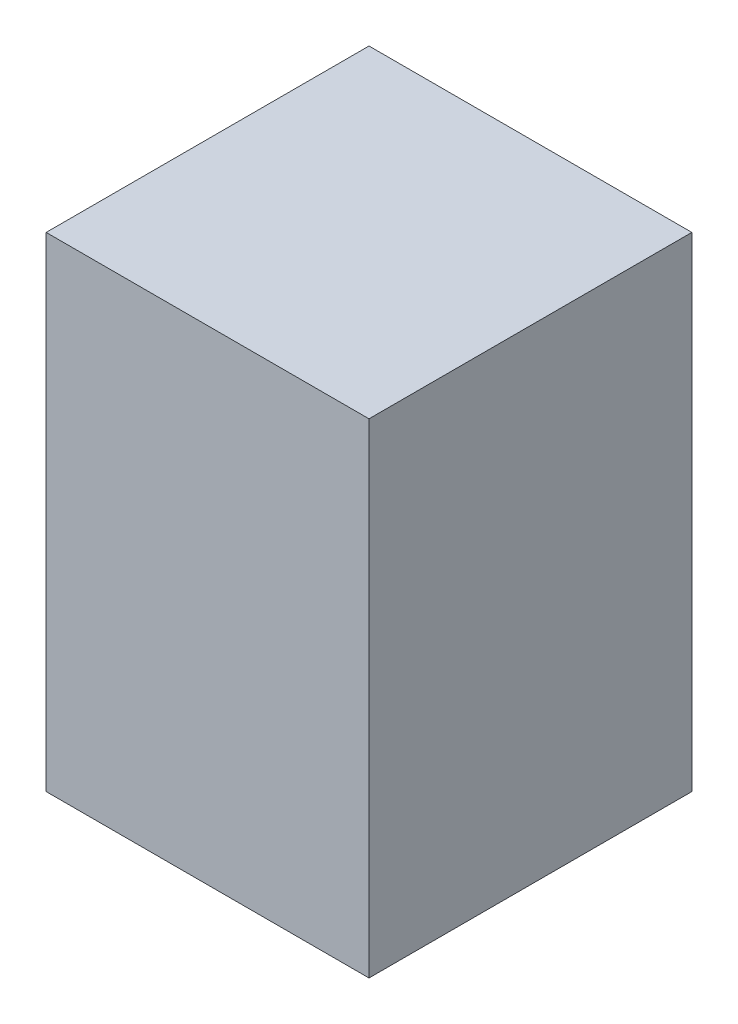
ISO-10303-21;
HEADER;
FILE_DESCRIPTION(('STEP AP214'),'2;1');
FILE_NAME('part.step','',(''),(''),'','','');
FILE_SCHEMA(('AUTOMOTIVE_DESIGN { 1 0 10303 214 1 1 1 1 }'));
ENDSEC;
DATA;
#1=APPLICATION_CONTEXT('core data for automotive mechanical design processes');
#2=APPLICATION_PROTOCOL_DEFINITION('international standard','automotive_design',2000,#1);
#3=PRODUCT_CONTEXT('',#1,'mechanical');
#4=PRODUCT('Part','Part','',(#3));
#5=PRODUCT_RELATED_PRODUCT_CATEGORY('part','',(#4));
#6=PRODUCT_DEFINITION_FORMATION('','',#4);
#7=PRODUCT_DEFINITION_CONTEXT('part definition',#1,'design');
#8=PRODUCT_DEFINITION('design','',#6,#7);
#9=PRODUCT_DEFINITION_SHAPE('','',#8);
#10=(LENGTH_UNIT() NAMED_UNIT(*) SI_UNIT(.MILLI.,.METRE.));
#11=(NAMED_UNIT(*) PLANE_ANGLE_UNIT() SI_UNIT($,.RADIAN.));
#12=(NAMED_UNIT(*) SI_UNIT($,.STERADIAN.) SOLID_ANGLE_UNIT());
#13=UNCERTAINTY_MEASURE_WITH_UNIT(LENGTH_MEASURE(1.E-05),#10,'distance_accuracy_value','');
#14=(GEOMETRIC_REPRESENTATION_CONTEXT(3) GLOBAL_UNCERTAINTY_ASSIGNED_CONTEXT((#13)) GLOBAL_UNIT_ASSIGNED_CONTEXT((#10,
#11,#12)) REPRESENTATION_CONTEXT('',''));
#15=CARTESIAN_POINT('',(0.,0.,0.));
#16=DIRECTION('',(0.,0.,1.));
#17=DIRECTION('',(1.,0.,0.));
#18=AXIS2_PLACEMENT_3D('',#15,#16,#17);
#19=CARTESIAN_POINT('',(2000.,6000.,2000.));
#20=DIRECTION('',(-1.,0.,0.));
#21=DIRECTION('',(0.,0.,1.));
#22=AXIS2_PLACEMENT_3D('',#19,#20,#21);
#23=PLANE('',#22);
#24=DIRECTION('',(0.,0.,-1.));
#25=VECTOR('',#24,1.);
#26=CARTESIAN_POINT('',(2000.,0.,2000.));
#27=LINE('',#26,#25);
#28=CARTESIAN_POINT('',(2000.,0.,2000.));
#29=VERTEX_POINT('',#28);
#30=CARTESIAN_POINT('',(2000.,0.,-2000.));
#31=VERTEX_POINT('',#30);
#32=EDGE_CURVE('E107',#29,#31,#27,.T.);
#33=ORIENTED_EDGE('',*,*,#32,.T.);
#34=DIRECTION('',(0.,-1.,0.));
#35=VECTOR('',#34,1.);
#36=CARTESIAN_POINT('',(2000.,6000.,-2000.));
#37=LINE('',#36,#35);
#38=CARTESIAN_POINT('',(2000.,6000.,-2000.));
#39=VERTEX_POINT('',#38);
#40=EDGE_CURVE('E11',#39,#31,#37,.T.);
#41=ORIENTED_EDGE('',*,*,#40,.F.);
#42=DIRECTION('',(0.,0.,-1.));
#43=VECTOR('',#42,1.);
#44=CARTESIAN_POINT('',(2000.,6000.,2000.));
#45=LINE('',#44,#43);
#46=CARTESIAN_POINT('',(2000.,6000.,2000.));
#47=VERTEX_POINT('',#46);
#48=EDGE_CURVE('E91',#47,#39,#45,.T.);
#49=ORIENTED_EDGE('',*,*,#48,.F.);
#50=DIRECTION('',(0.,-1.,0.));
#51=VECTOR('',#50,1.);
#52=CARTESIAN_POINT('',(2000.,6000.,2000.));
#53=LINE('',#52,#51);
#54=EDGE_CURVE('E103',#47,#29,#53,.T.);
#55=ORIENTED_EDGE('',*,*,#54,.T.);
#56=EDGE_LOOP('',(#33,#41,#49,#55));
#57=FACE_BOUND('',#56,.T.);
#58=ADVANCED_FACE('F39',(#57),#23,.F.);
#59=CARTESIAN_POINT('',(-2000.,6000.,-2000.));
#60=DIRECTION('',(0.,0.,1.));
#61=DIRECTION('',(1.,0.,0.));
#62=AXIS2_PLACEMENT_3D('',#59,#60,#61);
#63=PLANE('',#62);
#64=DIRECTION('',(-1.,0.,0.));
#65=VECTOR('',#64,1.);
#66=CARTESIAN_POINT('',(-2000.,0.,-2000.));
#67=LINE('',#66,#65);
#68=CARTESIAN_POINT('',(-2000.,0.,-2000.));
#69=VERTEX_POINT('',#68);
#70=EDGE_CURVE('E96',#31,#69,#67,.T.);
#71=ORIENTED_EDGE('',*,*,#70,.T.);
#72=DIRECTION('',(0.,-1.,0.));
#73=VECTOR('',#72,1.);
#74=CARTESIAN_POINT('',(-2000.,6000.,-2000.));
#75=LINE('',#74,#73);
#76=CARTESIAN_POINT('',(-2000.,6000.,-2000.));
#77=VERTEX_POINT('',#76);
#78=EDGE_CURVE('E48',#77,#69,#75,.T.);
#79=ORIENTED_EDGE('',*,*,#78,.F.);
#80=DIRECTION('',(-1.,0.,0.));
#81=VECTOR('',#80,1.);
#82=CARTESIAN_POINT('',(-2000.,6000.,-2000.));
#83=LINE('',#82,#81);
#84=EDGE_CURVE('E86',#39,#77,#83,.T.);
#85=ORIENTED_EDGE('',*,*,#84,.F.);
#86=ORIENTED_EDGE('',*,*,#40,.T.);
#87=EDGE_LOOP('',(#71,#79,#85,#86));
#88=FACE_BOUND('',#87,.T.);
#89=ADVANCED_FACE('F95',(#88),#63,.F.);
#90=CARTESIAN_POINT('',(-2000.,6000.,2000.));
#91=DIRECTION('',(1.,0.,0.));
#92=DIRECTION('',(0.,0.,-1.));
#93=AXIS2_PLACEMENT_3D('',#90,#91,#92);
#94=PLANE('',#93);
#95=DIRECTION('',(0.,0.,1.));
#96=VECTOR('',#95,1.);
#97=CARTESIAN_POINT('',(-2000.,0.,2000.));
#98=LINE('',#97,#96);
#99=CARTESIAN_POINT('',(-2000.,0.,2000.));
#100=VERTEX_POINT('',#99);
#101=EDGE_CURVE('E73',#69,#100,#98,.T.);
#102=ORIENTED_EDGE('',*,*,#101,.T.);
#103=DIRECTION('',(0.,-1.,0.));
#104=VECTOR('',#103,1.);
#105=CARTESIAN_POINT('',(-2000.,6000.,2000.));
#106=LINE('',#105,#104);
#107=CARTESIAN_POINT('',(-2000.,6000.,2000.));
#108=VERTEX_POINT('',#107);
#109=EDGE_CURVE('E98',#108,#100,#106,.T.);
#110=ORIENTED_EDGE('',*,*,#109,.F.);
#111=DIRECTION('',(0.,0.,1.));
#112=VECTOR('',#111,1.);
#113=CARTESIAN_POINT('',(-2000.,6000.,2000.));
#114=LINE('',#113,#112);
#115=EDGE_CURVE('E89',#77,#108,#114,.T.);
#116=ORIENTED_EDGE('',*,*,#115,.F.);
#117=ORIENTED_EDGE('',*,*,#78,.T.);
#118=EDGE_LOOP('',(#102,#110,#116,#117));
#119=FACE_BOUND('',#118,.T.);
#120=ADVANCED_FACE('F99',(#119),#94,.F.);
#121=CARTESIAN_POINT('',(-2000.,6000.,2000.));
#122=DIRECTION('',(0.,0.,-1.));
#123=DIRECTION('',(-1.,0.,0.));
#124=AXIS2_PLACEMENT_3D('',#121,#122,#123);
#125=PLANE('',#124);
#126=DIRECTION('',(1.,0.,0.));
#127=VECTOR('',#126,1.);
#128=CARTESIAN_POINT('',(-2000.,0.,2000.));
#129=LINE('',#128,#127);
#130=EDGE_CURVE('E79',#100,#29,#129,.T.);
#131=ORIENTED_EDGE('',*,*,#130,.T.);
#132=ORIENTED_EDGE('',*,*,#54,.F.);
#133=DIRECTION('',(1.,0.,0.));
#134=VECTOR('',#133,1.);
#135=CARTESIAN_POINT('',(-2000.,6000.,2000.));
#136=LINE('',#135,#134);
#137=EDGE_CURVE('E56',#108,#47,#136,.T.);
#138=ORIENTED_EDGE('',*,*,#137,.F.);
#139=ORIENTED_EDGE('',*,*,#109,.T.);
#140=EDGE_LOOP('',(#131,#132,#138,#139));
#141=FACE_BOUND('',#140,.T.);
#142=ADVANCED_FACE('F120',(#141),#125,.F.);
#143=CARTESIAN_POINT('',(0.,6000.,0.));
#144=DIRECTION('',(0.,-1.,0.));
#145=DIRECTION('',(0.,0.,-1.));
#146=AXIS2_PLACEMENT_3D('',#143,#144,#145);
#147=PLANE('',#146);
#148=ORIENTED_EDGE('',*,*,#48,.T.);
#149=ORIENTED_EDGE('',*,*,#84,.T.);
#150=ORIENTED_EDGE('',*,*,#115,.T.);
#151=ORIENTED_EDGE('',*,*,#137,.T.);
#152=EDGE_LOOP('',(#148,#149,#150,#151));
#153=FACE_BOUND('',#152,.T.);
#154=ADVANCED_FACE('F87',(#153),#147,.F.);
#155=CARTESIAN_POINT('',(0.,0.,0.));
#156=DIRECTION('',(0.,-1.,0.));
#157=DIRECTION('',(0.,0.,-1.));
#158=AXIS2_PLACEMENT_3D('',#155,#156,#157);
#159=PLANE('',#158);
#160=ORIENTED_EDGE('',*,*,#32,.F.);
#161=ORIENTED_EDGE('',*,*,#130,.F.);
#162=ORIENTED_EDGE('',*,*,#101,.F.);
#163=ORIENTED_EDGE('',*,*,#70,.F.);
#164=EDGE_LOOP('',(#160,#161,#162,#163));
#165=FACE_BOUND('',#164,.T.);
#166=ADVANCED_FACE('F123',(#165),#159,.T.);
#167=CLOSED_SHELL('',(#58,#89,#120,#142,#154,#166));
#168=MANIFOLD_SOLID_BREP('B2',#167);
#169=ADVANCED_BREP_SHAPE_REPRESENTATION('',(#18,#168),#14);
#170=SHAPE_DEFINITION_REPRESENTATION(#9,#169);
ENDSEC;
END-ISO-10303-21;
